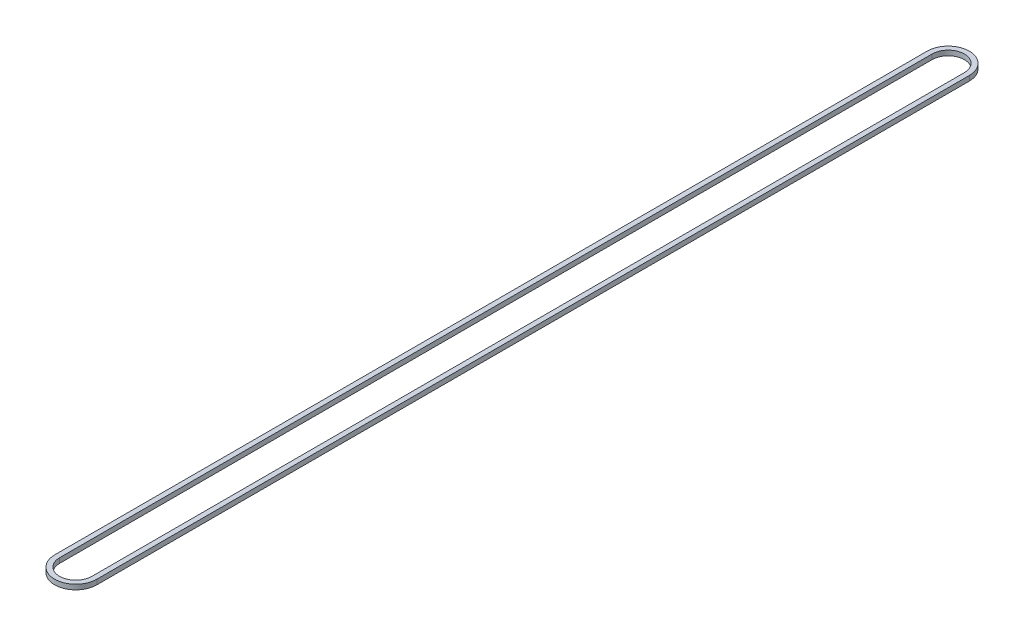
ISO-10303-21;
HEADER;
FILE_DESCRIPTION(('STEP AP214'),'2;1');
FILE_NAME('part.step','',(''),(''),'','','');
FILE_SCHEMA(('AUTOMOTIVE_DESIGN { 1 0 10303 214 1 1 1 1 }'));
ENDSEC;
DATA;
#1=APPLICATION_CONTEXT('core data for automotive mechanical design processes');
#2=APPLICATION_PROTOCOL_DEFINITION('international standard','automotive_design',2000,#1);
#3=PRODUCT_CONTEXT('',#1,'mechanical');
#4=PRODUCT('Part','Part','',(#3));
#5=PRODUCT_RELATED_PRODUCT_CATEGORY('part','',(#4));
#6=PRODUCT_DEFINITION_FORMATION('','',#4);
#7=PRODUCT_DEFINITION_CONTEXT('part definition',#1,'design');
#8=PRODUCT_DEFINITION('design','',#6,#7);
#9=PRODUCT_DEFINITION_SHAPE('','',#8);
#10=(LENGTH_UNIT() NAMED_UNIT(*) SI_UNIT(.MILLI.,.METRE.));
#11=(NAMED_UNIT(*) PLANE_ANGLE_UNIT() SI_UNIT($,.RADIAN.));
#12=(NAMED_UNIT(*) SI_UNIT($,.STERADIAN.) SOLID_ANGLE_UNIT());
#13=UNCERTAINTY_MEASURE_WITH_UNIT(LENGTH_MEASURE(1.E-05),#10,'distance_accuracy_value','');
#14=(GEOMETRIC_REPRESENTATION_CONTEXT(3) GLOBAL_UNCERTAINTY_ASSIGNED_CONTEXT((#13)) GLOBAL_UNIT_ASSIGNED_CONTEXT((#10,
#11,#12)) REPRESENTATION_CONTEXT('',''));
#15=CARTESIAN_POINT('',(0.,0.,0.));
#16=DIRECTION('',(0.,0.,1.));
#17=DIRECTION('',(1.,0.,0.));
#18=AXIS2_PLACEMENT_3D('',#15,#16,#17);
#19=CARTESIAN_POINT('',(-480.8474,-6.35,561.975));
#20=DIRECTION('',(1.,0.,0.));
#21=DIRECTION('',(0.,0.,-1.));
#22=AXIS2_PLACEMENT_3D('',#19,#20,#21);
#23=PLANE('',#22);
#24=DIRECTION('',(0.,0.,-1.));
#25=VECTOR('',#24,1.);
#26=CARTESIAN_POINT('',(-480.8474,0.,561.975));
#27=LINE('',#26,#25);
#28=CARTESIAN_POINT('',(-480.8474,0.,1123.95));
#29=VERTEX_POINT('',#28);
#30=CARTESIAN_POINT('',(-480.8474,0.,0.));
#31=VERTEX_POINT('',#30);
#32=EDGE_CURVE('E125',#29,#31,#27,.T.);
#33=ORIENTED_EDGE('',*,*,#32,.F.);
#34=DIRECTION('',(0.,1.,0.));
#35=VECTOR('',#34,1.);
#36=CARTESIAN_POINT('',(-480.8474,-6.35,1123.95));
#37=LINE('',#36,#35);
#38=CARTESIAN_POINT('',(-480.8474,-6.35,1123.95));
#39=VERTEX_POINT('',#38);
#40=EDGE_CURVE('E11',#39,#29,#37,.T.);
#41=ORIENTED_EDGE('',*,*,#40,.F.);
#42=DIRECTION('',(0.,0.,-1.));
#43=VECTOR('',#42,1.);
#44=CARTESIAN_POINT('',(-480.8474,-6.35,561.975));
#45=LINE('',#44,#43);
#46=CARTESIAN_POINT('',(-480.8474,-6.35,0.));
#47=VERTEX_POINT('',#46);
#48=EDGE_CURVE('E96',#39,#47,#45,.T.);
#49=ORIENTED_EDGE('',*,*,#48,.T.);
#50=DIRECTION('',(0.,1.,0.));
#51=VECTOR('',#50,1.);
#52=CARTESIAN_POINT('',(-480.8474,-6.35,0.));
#53=LINE('',#52,#51);
#54=EDGE_CURVE('E70',#47,#31,#53,.T.);
#55=ORIENTED_EDGE('',*,*,#54,.T.);
#56=EDGE_LOOP('',(#33,#41,#49,#55));
#57=FACE_BOUND('',#56,.T.);
#58=ADVANCED_FACE('F17',(#57),#23,.T.);
#59=CARTESIAN_POINT('',(-508.,-6.35,1123.95));
#60=DIRECTION('',(0.,1.,0.));
#61=DIRECTION('',(0.,0.,1.));
#62=AXIS2_PLACEMENT_3D('',#59,#60,#61);
#63=CYLINDRICAL_SURFACE('',#62,27.1526);
#64=CARTESIAN_POINT('',(-508.,0.,1123.95));
#65=DIRECTION('',(0.,-1.,0.));
#66=DIRECTION('',(0.,0.,-1.));
#67=AXIS2_PLACEMENT_3D('',#64,#65,#66);
#68=CIRCLE('',#67,27.1526);
#69=CARTESIAN_POINT('',(-535.1526,0.,1123.95));
#70=VERTEX_POINT('',#69);
#71=EDGE_CURVE('E102',#29,#70,#68,.T.);
#72=ORIENTED_EDGE('',*,*,#71,.T.);
#73=DIRECTION('',(0.,1.,0.));
#74=VECTOR('',#73,1.);
#75=CARTESIAN_POINT('',(-535.1526,-6.35,1123.95));
#76=LINE('',#75,#74);
#77=CARTESIAN_POINT('',(-535.1526,-6.35,1123.95));
#78=VERTEX_POINT('',#77);
#79=EDGE_CURVE('E27',#78,#70,#76,.T.);
#80=ORIENTED_EDGE('',*,*,#79,.F.);
#81=CARTESIAN_POINT('',(-508.,-6.35,1123.95));
#82=DIRECTION('',(0.,-1.,0.));
#83=DIRECTION('',(0.,0.,-1.));
#84=AXIS2_PLACEMENT_3D('',#81,#82,#83);
#85=CIRCLE('',#84,27.1526);
#86=EDGE_CURVE('E91',#39,#78,#85,.T.);
#87=ORIENTED_EDGE('',*,*,#86,.F.);
#88=ORIENTED_EDGE('',*,*,#40,.T.);
#89=EDGE_LOOP('',(#72,#80,#87,#88));
#90=FACE_BOUND('',#89,.T.);
#91=ADVANCED_FACE('F100',(#90),#63,.T.);
#92=CARTESIAN_POINT('',(-535.1526,-6.35,561.975));
#93=DIRECTION('',(-1.,0.,0.));
#94=DIRECTION('',(0.,0.,1.));
#95=AXIS2_PLACEMENT_3D('',#92,#93,#94);
#96=PLANE('',#95);
#97=DIRECTION('',(0.,0.,1.));
#98=VECTOR('',#97,1.);
#99=CARTESIAN_POINT('',(-535.1526,0.,561.975));
#100=LINE('',#99,#98);
#101=CARTESIAN_POINT('',(-535.1526,0.,0.));
#102=VERTEX_POINT('',#101);
#103=EDGE_CURVE('E129',#102,#70,#100,.T.);
#104=ORIENTED_EDGE('',*,*,#103,.F.);
#105=DIRECTION('',(0.,1.,0.));
#106=VECTOR('',#105,1.);
#107=CARTESIAN_POINT('',(-535.1526,-6.35,0.));
#108=LINE('',#107,#106);
#109=CARTESIAN_POINT('',(-535.1526,-6.35,0.));
#110=VERTEX_POINT('',#109);
#111=EDGE_CURVE('E63',#110,#102,#108,.T.);
#112=ORIENTED_EDGE('',*,*,#111,.F.);
#113=DIRECTION('',(0.,0.,1.));
#114=VECTOR('',#113,1.);
#115=CARTESIAN_POINT('',(-535.1526,-6.35,561.975));
#116=LINE('',#115,#114);
#117=EDGE_CURVE('E95',#110,#78,#116,.T.);
#118=ORIENTED_EDGE('',*,*,#117,.T.);
#119=ORIENTED_EDGE('',*,*,#79,.T.);
#120=EDGE_LOOP('',(#104,#112,#118,#119));
#121=FACE_BOUND('',#120,.T.);
#122=ADVANCED_FACE('F107',(#121),#96,.T.);
#123=CARTESIAN_POINT('',(-508.,-6.35,0.));
#124=DIRECTION('',(0.,1.,0.));
#125=DIRECTION('',(0.,0.,1.));
#126=AXIS2_PLACEMENT_3D('',#123,#124,#125);
#127=CYLINDRICAL_SURFACE('',#126,20.8026);
#128=CARTESIAN_POINT('',(-508.,0.,0.));
#129=DIRECTION('',(0.,-1.,0.));
#130=DIRECTION('',(0.,0.,-1.));
#131=AXIS2_PLACEMENT_3D('',#128,#129,#130);
#132=CIRCLE('',#131,20.8026);
#133=CARTESIAN_POINT('',(-528.8026,0.,0.));
#134=VERTEX_POINT('',#133);
#135=CARTESIAN_POINT('',(-487.1974,0.,0.));
#136=VERTEX_POINT('',#135);
#137=EDGE_CURVE('E113',#134,#136,#132,.T.);
#138=ORIENTED_EDGE('',*,*,#137,.F.);
#139=DIRECTION('',(0.,1.,0.));
#140=VECTOR('',#139,1.);
#141=CARTESIAN_POINT('',(-528.8026,-6.35,0.));
#142=LINE('',#141,#140);
#143=CARTESIAN_POINT('',(-528.8026,-6.35,0.));
#144=VERTEX_POINT('',#143);
#145=EDGE_CURVE('E21',#144,#134,#142,.T.);
#146=ORIENTED_EDGE('',*,*,#145,.F.);
#147=CARTESIAN_POINT('',(-508.,-6.35,0.));
#148=DIRECTION('',(0.,-1.,0.));
#149=DIRECTION('',(0.,0.,-1.));
#150=AXIS2_PLACEMENT_3D('',#147,#148,#149);
#151=CIRCLE('',#150,20.8026);
#152=CARTESIAN_POINT('',(-487.1974,-6.35,0.));
#153=VERTEX_POINT('',#152);
#154=EDGE_CURVE('E133',#144,#153,#151,.T.);
#155=ORIENTED_EDGE('',*,*,#154,.T.);
#156=DIRECTION('',(0.,1.,0.));
#157=VECTOR('',#156,1.);
#158=CARTESIAN_POINT('',(-487.1974,-6.35,0.));
#159=LINE('',#158,#157);
#160=EDGE_CURVE('E109',#153,#136,#159,.T.);
#161=ORIENTED_EDGE('',*,*,#160,.T.);
#162=EDGE_LOOP('',(#138,#146,#155,#161));
#163=FACE_BOUND('',#162,.T.);
#164=ADVANCED_FACE('F19',(#163),#127,.F.);
#165=CARTESIAN_POINT('',(-528.8026,-6.35,561.975));
#166=DIRECTION('',(-1.,0.,0.));
#167=DIRECTION('',(0.,0.,1.));
#168=AXIS2_PLACEMENT_3D('',#165,#166,#167);
#169=PLANE('',#168);
#170=DIRECTION('',(0.,0.,1.));
#171=VECTOR('',#170,1.);
#172=CARTESIAN_POINT('',(-528.8026,0.,561.975));
#173=LINE('',#172,#171);
#174=CARTESIAN_POINT('',(-528.8026,0.,1123.95));
#175=VERTEX_POINT('',#174);
#176=EDGE_CURVE('E116',#134,#175,#173,.T.);
#177=ORIENTED_EDGE('',*,*,#176,.T.);
#178=DIRECTION('',(0.,1.,0.));
#179=VECTOR('',#178,1.);
#180=CARTESIAN_POINT('',(-528.8026,-6.35,1123.95));
#181=LINE('',#180,#179);
#182=CARTESIAN_POINT('',(-528.8026,-6.35,1123.95));
#183=VERTEX_POINT('',#182);
#184=EDGE_CURVE('E138',#183,#175,#181,.T.);
#185=ORIENTED_EDGE('',*,*,#184,.F.);
#186=DIRECTION('',(0.,0.,1.));
#187=VECTOR('',#186,1.);
#188=CARTESIAN_POINT('',(-528.8026,-6.35,561.975));
#189=LINE('',#188,#187);
#190=EDGE_CURVE('E146',#144,#183,#189,.T.);
#191=ORIENTED_EDGE('',*,*,#190,.F.);
#192=ORIENTED_EDGE('',*,*,#145,.T.);
#193=EDGE_LOOP('',(#177,#185,#191,#192));
#194=FACE_BOUND('',#193,.T.);
#195=ADVANCED_FACE('F145',(#194),#169,.F.);
#196=CARTESIAN_POINT('',(-508.,-6.35,1123.95));
#197=DIRECTION('',(0.,1.,0.));
#198=DIRECTION('',(0.,0.,1.));
#199=AXIS2_PLACEMENT_3D('',#196,#197,#198);
#200=CYLINDRICAL_SURFACE('',#199,20.8026);
#201=CARTESIAN_POINT('',(-508.,0.,1123.95));
#202=DIRECTION('',(0.,-1.,0.));
#203=DIRECTION('',(0.,0.,-1.));
#204=AXIS2_PLACEMENT_3D('',#201,#202,#203);
#205=CIRCLE('',#204,20.8026);
#206=CARTESIAN_POINT('',(-487.1974,0.,1123.95));
#207=VERTEX_POINT('',#206);
#208=EDGE_CURVE('E119',#207,#175,#205,.T.);
#209=ORIENTED_EDGE('',*,*,#208,.F.);
#210=DIRECTION('',(0.,1.,0.));
#211=VECTOR('',#210,1.);
#212=CARTESIAN_POINT('',(-487.1974,-6.35,1123.95));
#213=LINE('',#212,#211);
#214=CARTESIAN_POINT('',(-487.1974,-6.35,1123.95));
#215=VERTEX_POINT('',#214);
#216=EDGE_CURVE('E137',#215,#207,#213,.T.);
#217=ORIENTED_EDGE('',*,*,#216,.F.);
#218=CARTESIAN_POINT('',(-508.,-6.35,1123.95));
#219=DIRECTION('',(0.,-1.,0.));
#220=DIRECTION('',(0.,0.,-1.));
#221=AXIS2_PLACEMENT_3D('',#218,#219,#220);
#222=CIRCLE('',#221,20.8026);
#223=EDGE_CURVE('E158',#215,#183,#222,.T.);
#224=ORIENTED_EDGE('',*,*,#223,.T.);
#225=ORIENTED_EDGE('',*,*,#184,.T.);
#226=EDGE_LOOP('',(#209,#217,#224,#225));
#227=FACE_BOUND('',#226,.T.);
#228=ADVANCED_FACE('F156',(#227),#200,.F.);
#229=CARTESIAN_POINT('',(-487.1974,-6.35,561.975));
#230=DIRECTION('',(1.,0.,0.));
#231=DIRECTION('',(0.,0.,-1.));
#232=AXIS2_PLACEMENT_3D('',#229,#230,#231);
#233=PLANE('',#232);
#234=DIRECTION('',(0.,0.,-1.));
#235=VECTOR('',#234,1.);
#236=CARTESIAN_POINT('',(-487.1974,0.,561.975));
#237=LINE('',#236,#235);
#238=EDGE_CURVE('E122',#207,#136,#237,.T.);
#239=ORIENTED_EDGE('',*,*,#238,.T.);
#240=ORIENTED_EDGE('',*,*,#160,.F.);
#241=DIRECTION('',(0.,0.,-1.));
#242=VECTOR('',#241,1.);
#243=CARTESIAN_POINT('',(-487.1974,-6.35,561.975));
#244=LINE('',#243,#242);
#245=EDGE_CURVE('E159',#215,#153,#244,.T.);
#246=ORIENTED_EDGE('',*,*,#245,.F.);
#247=ORIENTED_EDGE('',*,*,#216,.T.);
#248=EDGE_LOOP('',(#239,#240,#246,#247));
#249=FACE_BOUND('',#248,.T.);
#250=ADVANCED_FACE('F155',(#249),#233,.F.);
#251=CARTESIAN_POINT('',(-508.,-6.35,0.));
#252=DIRECTION('',(0.,1.,0.));
#253=DIRECTION('',(0.,0.,1.));
#254=AXIS2_PLACEMENT_3D('',#251,#252,#253);
#255=CYLINDRICAL_SURFACE('',#254,27.1526);
#256=CARTESIAN_POINT('',(-508.,0.,0.));
#257=DIRECTION('',(0.,-1.,0.));
#258=DIRECTION('',(0.,0.,-1.));
#259=AXIS2_PLACEMENT_3D('',#256,#257,#258);
#260=CIRCLE('',#259,27.1526);
#261=EDGE_CURVE('E131',#102,#31,#260,.T.);
#262=ORIENTED_EDGE('',*,*,#261,.T.);
#263=ORIENTED_EDGE('',*,*,#54,.F.);
#264=CARTESIAN_POINT('',(-508.,-6.35,0.));
#265=DIRECTION('',(0.,-1.,0.));
#266=DIRECTION('',(0.,0.,-1.));
#267=AXIS2_PLACEMENT_3D('',#264,#265,#266);
#268=CIRCLE('',#267,27.1526);
#269=EDGE_CURVE('E36',#110,#47,#268,.T.);
#270=ORIENTED_EDGE('',*,*,#269,.F.);
#271=ORIENTED_EDGE('',*,*,#111,.T.);
#272=EDGE_LOOP('',(#262,#263,#270,#271));
#273=FACE_BOUND('',#272,.T.);
#274=ADVANCED_FACE('F165',(#273),#255,.T.);
#275=CARTESIAN_POINT('',(-508.,-6.35,561.975));
#276=DIRECTION('',(0.,-1.,0.));
#277=DIRECTION('',(1.,0.,0.));
#278=AXIS2_PLACEMENT_3D('',#275,#276,#277);
#279=PLANE('',#278);
#280=ORIENTED_EDGE('',*,*,#154,.F.);
#281=ORIENTED_EDGE('',*,*,#190,.T.);
#282=ORIENTED_EDGE('',*,*,#223,.F.);
#283=ORIENTED_EDGE('',*,*,#245,.T.);
#284=EDGE_LOOP('',(#280,#281,#282,#283));
#285=FACE_BOUND('',#284,.T.);
#286=ORIENTED_EDGE('',*,*,#48,.F.);
#287=ORIENTED_EDGE('',*,*,#86,.T.);
#288=ORIENTED_EDGE('',*,*,#117,.F.);
#289=ORIENTED_EDGE('',*,*,#269,.T.);
#290=EDGE_LOOP('',(#286,#287,#288,#289));
#291=FACE_BOUND('',#290,.T.);
#292=ADVANCED_FACE('F93',(#285,#291),#279,.T.);
#293=CARTESIAN_POINT('',(-508.,0.,561.975));
#294=DIRECTION('',(0.,-1.,0.));
#295=DIRECTION('',(1.,0.,0.));
#296=AXIS2_PLACEMENT_3D('',#293,#294,#295);
#297=PLANE('',#296);
#298=ORIENTED_EDGE('',*,*,#137,.T.);
#299=ORIENTED_EDGE('',*,*,#238,.F.);
#300=ORIENTED_EDGE('',*,*,#208,.T.);
#301=ORIENTED_EDGE('',*,*,#176,.F.);
#302=EDGE_LOOP('',(#298,#299,#300,#301));
#303=FACE_BOUND('',#302,.T.);
#304=ORIENTED_EDGE('',*,*,#32,.T.);
#305=ORIENTED_EDGE('',*,*,#261,.F.);
#306=ORIENTED_EDGE('',*,*,#103,.T.);
#307=ORIENTED_EDGE('',*,*,#71,.F.);
#308=EDGE_LOOP('',(#304,#305,#306,#307));
#309=FACE_BOUND('',#308,.T.);
#310=ADVANCED_FACE('F149',(#303,#309),#297,.F.);
#311=CLOSED_SHELL('',(#58,#91,#122,#164,#195,#228,#250,#274,#292,#310));
#312=MANIFOLD_SOLID_BREP('B1',#311);
#313=ADVANCED_BREP_SHAPE_REPRESENTATION('',(#18,#312),#14);
#314=SHAPE_DEFINITION_REPRESENTATION(#9,#313);
ENDSEC;
END-ISO-10303-21;
